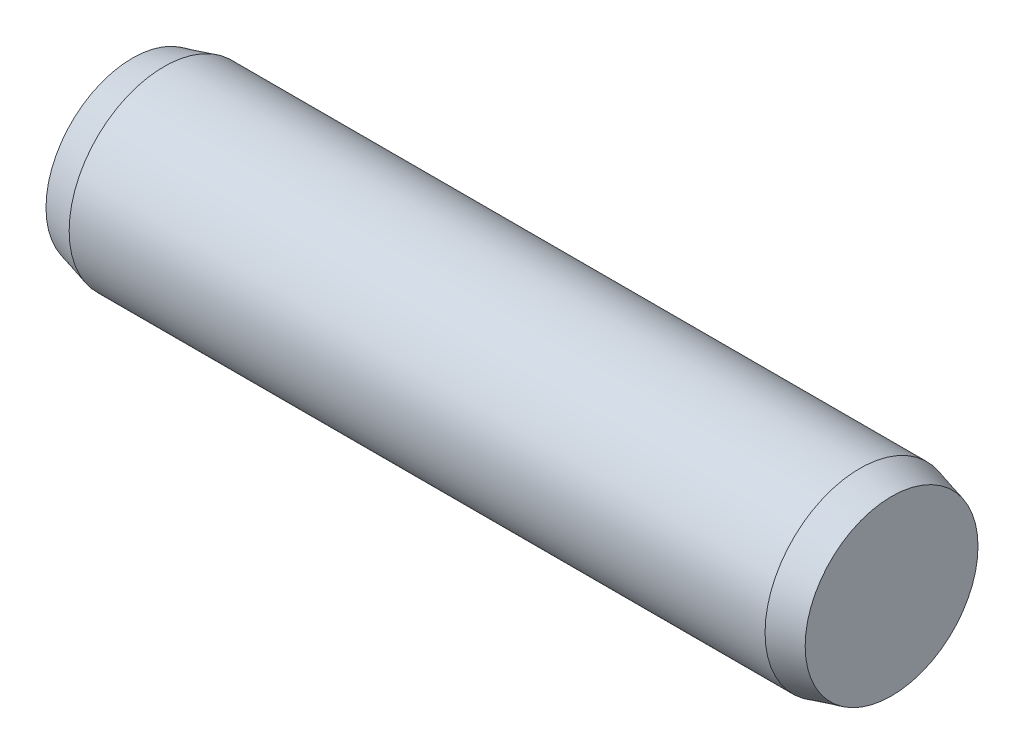
ISO-10303-21;
HEADER;
FILE_DESCRIPTION(('STEP AP214'),'2;1');
FILE_NAME('part.step','',(''),(''),'','','');
FILE_SCHEMA(('AUTOMOTIVE_DESIGN { 1 0 10303 214 1 1 1 1 }'));
ENDSEC;
DATA;
#1=APPLICATION_CONTEXT('core data for automotive mechanical design processes');
#2=APPLICATION_PROTOCOL_DEFINITION('international standard','automotive_design',2000,#1);
#3=PRODUCT_CONTEXT('',#1,'mechanical');
#4=PRODUCT('Part','Part','',(#3));
#5=PRODUCT_RELATED_PRODUCT_CATEGORY('part','',(#4));
#6=PRODUCT_DEFINITION_FORMATION('','',#4);
#7=PRODUCT_DEFINITION_CONTEXT('part definition',#1,'design');
#8=PRODUCT_DEFINITION('design','',#6,#7);
#9=PRODUCT_DEFINITION_SHAPE('','',#8);
#10=(LENGTH_UNIT() NAMED_UNIT(*) SI_UNIT(.MILLI.,.METRE.));
#11=(NAMED_UNIT(*) PLANE_ANGLE_UNIT() SI_UNIT($,.RADIAN.));
#12=(NAMED_UNIT(*) SI_UNIT($,.STERADIAN.) SOLID_ANGLE_UNIT());
#13=UNCERTAINTY_MEASURE_WITH_UNIT(LENGTH_MEASURE(1.E-05),#10,'distance_accuracy_value','');
#14=(GEOMETRIC_REPRESENTATION_CONTEXT(3) GLOBAL_UNCERTAINTY_ASSIGNED_CONTEXT((#13)) GLOBAL_UNIT_ASSIGNED_CONTEXT((#10,
#11,#12)) REPRESENTATION_CONTEXT('',''));
#15=CARTESIAN_POINT('',(0.,0.,0.));
#16=DIRECTION('',(0.,0.,1.));
#17=DIRECTION('',(1.,0.,0.));
#18=AXIS2_PLACEMENT_3D('',#15,#16,#17);
#19=CARTESIAN_POINT('',(-5.50000000000001,0.,0.));
#20=DIRECTION('',(1.,0.,0.));
#21=DIRECTION('',(0.,0.,-1.));
#22=AXIS2_PLACEMENT_3D('',#19,#20,#21);
#23=CYLINDRICAL_SURFACE('',#22,1.5);
#24=CARTESIAN_POINT('',(-5.50000000000001,0.,0.));
#25=DIRECTION('',(-1.,0.,0.));
#26=DIRECTION('',(0.,0.,1.));
#27=AXIS2_PLACEMENT_3D('',#24,#25,#26);
#28=CIRCLE('',#27,1.5);
#29=CARTESIAN_POINT('',(-5.50000000000001,0.,1.5));
#30=VERTEX_POINT('',#29);
#31=EDGE_CURVE('E58',#30,#30,#28,.T.);
#32=ORIENTED_EDGE('',*,*,#31,.F.);
#33=EDGE_LOOP('',(#32));
#34=FACE_BOUND('',#33,.T.);
#35=CARTESIAN_POINT('',(5.50000000000001,5.55111512312578E-13,-2.22044604925031E-13));
#36=DIRECTION('',(1.,0.,0.));
#37=DIRECTION('',(0.,0.,-1.));
#38=AXIS2_PLACEMENT_3D('',#35,#36,#37);
#39=CIRCLE('',#38,1.5);
#40=CARTESIAN_POINT('',(5.50000000000001,5.55111512312578E-13,-1.50000000000023));
#41=VERTEX_POINT('',#40);
#42=EDGE_CURVE('E10',#41,#41,#39,.T.);
#43=ORIENTED_EDGE('',*,*,#42,.F.);
#44=EDGE_LOOP('',(#43));
#45=FACE_BOUND('',#44,.T.);
#46=ADVANCED_FACE('F41',(#34,#45),#23,.T.);
#47=CARTESIAN_POINT('',(5.50000000000001,5.55111512312578E-13,-2.22044604925031E-13));
#48=DIRECTION('',(-1.,0.,0.));
#49=DIRECTION('',(0.,0.,-1.));
#50=AXIS2_PLACEMENT_3D('',#47,#48,#49);
#51=CONICAL_SURFACE('',#50,1.5,0.26179938779915);
#52=CARTESIAN_POINT('',(6.00000000000001,5.55111512312578E-13,-2.22044604925031E-13));
#53=DIRECTION('',(1.,0.,0.));
#54=DIRECTION('',(0.,0.,-1.));
#55=AXIS2_PLACEMENT_3D('',#52,#53,#54);
#56=CIRCLE('',#55,1.36602540378444);
#57=CARTESIAN_POINT('',(6.00000000000001,5.55111512312578E-13,-1.36602540378467));
#58=VERTEX_POINT('',#57);
#59=EDGE_CURVE('E48',#58,#58,#56,.T.);
#60=ORIENTED_EDGE('',*,*,#59,.F.);
#61=EDGE_LOOP('',(#60));
#62=FACE_BOUND('',#61,.T.);
#63=ORIENTED_EDGE('',*,*,#42,.T.);
#64=EDGE_LOOP('',(#63));
#65=FACE_BOUND('',#64,.T.);
#66=ADVANCED_FACE('F69',(#62,#65),#51,.T.);
#67=CARTESIAN_POINT('',(6.00000000000001,5.55111512312578E-13,-2.22044604925031E-13));
#68=DIRECTION('',(1.,0.,0.));
#69=DIRECTION('',(0.,0.,-1.));
#70=AXIS2_PLACEMENT_3D('',#67,#68,#69);
#71=PLANE('',#70);
#72=ORIENTED_EDGE('',*,*,#59,.T.);
#73=EDGE_LOOP('',(#72));
#74=FACE_BOUND('',#73,.T.);
#75=ADVANCED_FACE('F73',(#74),#71,.T.);
#76=CARTESIAN_POINT('',(-5.50000000000001,0.,0.));
#77=DIRECTION('',(1.,0.,0.));
#78=DIRECTION('',(0.,0.,1.));
#79=AXIS2_PLACEMENT_3D('',#76,#77,#78);
#80=CONICAL_SURFACE('',#79,1.5,0.26179938779915);
#81=CARTESIAN_POINT('',(-6.00000000000001,0.,0.));
#82=DIRECTION('',(-1.,0.,0.));
#83=DIRECTION('',(0.,0.,1.));
#84=AXIS2_PLACEMENT_3D('',#81,#82,#83);
#85=CIRCLE('',#84,1.36602540378444);
#86=CARTESIAN_POINT('',(-6.00000000000001,0.,1.36602540378444));
#87=VERTEX_POINT('',#86);
#88=EDGE_CURVE('E53',#87,#87,#85,.T.);
#89=ORIENTED_EDGE('',*,*,#88,.F.);
#90=EDGE_LOOP('',(#89));
#91=FACE_BOUND('',#90,.T.);
#92=ORIENTED_EDGE('',*,*,#31,.T.);
#93=EDGE_LOOP('',(#92));
#94=FACE_BOUND('',#93,.T.);
#95=ADVANCED_FACE('F65',(#91,#94),#80,.T.);
#96=CARTESIAN_POINT('',(-6.00000000000001,0.,0.));
#97=DIRECTION('',(-1.,0.,0.));
#98=DIRECTION('',(0.,0.,1.));
#99=AXIS2_PLACEMENT_3D('',#96,#97,#98);
#100=PLANE('',#99);
#101=ORIENTED_EDGE('',*,*,#88,.T.);
#102=EDGE_LOOP('',(#101));
#103=FACE_BOUND('',#102,.T.);
#104=ADVANCED_FACE('F82',(#103),#100,.T.);
#105=CLOSED_SHELL('',(#46,#66,#75,#95,#104));
#106=MANIFOLD_SOLID_BREP('B2',#105);
#107=ADVANCED_BREP_SHAPE_REPRESENTATION('',(#18,#106),#14);
#108=SHAPE_DEFINITION_REPRESENTATION(#9,#107);
ENDSEC;
END-ISO-10303-21;
